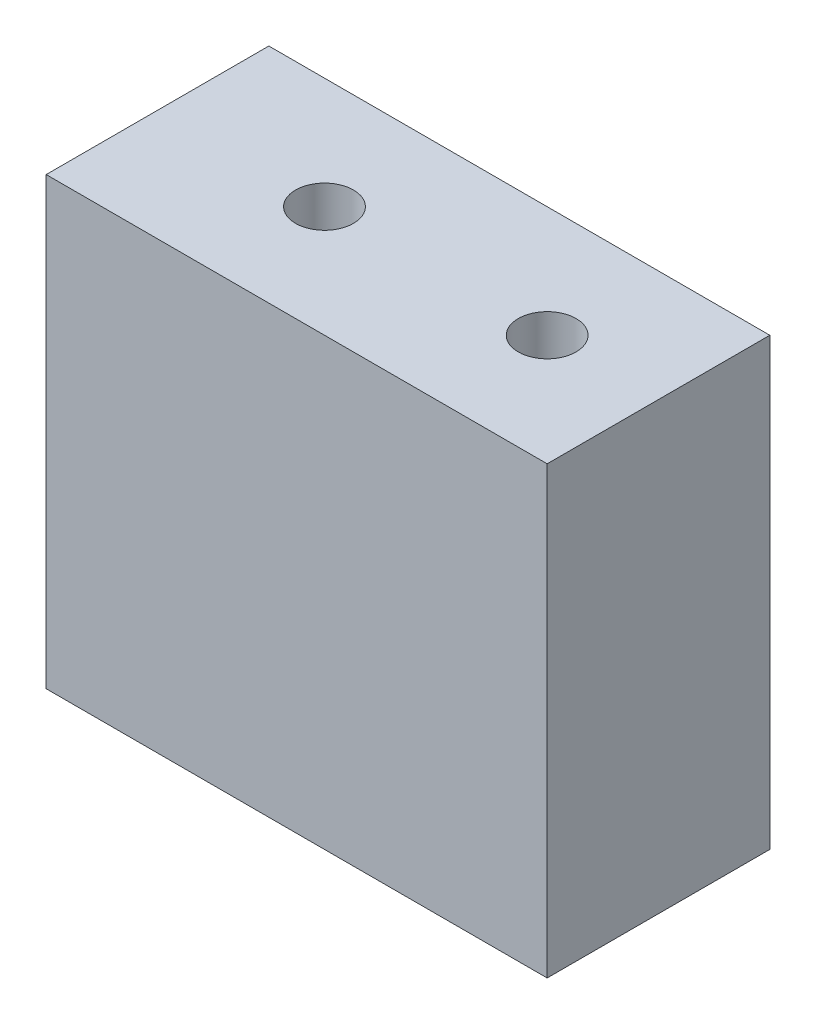
ISO-10303-21;
HEADER;
FILE_DESCRIPTION(('STEP AP214'),'2;1');
FILE_NAME('part.step','',(''),(''),'','','');
FILE_SCHEMA(('AUTOMOTIVE_DESIGN { 1 0 10303 214 1 1 1 1 }'));
ENDSEC;
DATA;
#1=APPLICATION_CONTEXT('core data for automotive mechanical design processes');
#2=APPLICATION_PROTOCOL_DEFINITION('international standard','automotive_design',2000,#1);
#3=PRODUCT_CONTEXT('',#1,'mechanical');
#4=PRODUCT('Part','Part','',(#3));
#5=PRODUCT_RELATED_PRODUCT_CATEGORY('part','',(#4));
#6=PRODUCT_DEFINITION_FORMATION('','',#4);
#7=PRODUCT_DEFINITION_CONTEXT('part definition',#1,'design');
#8=PRODUCT_DEFINITION('design','',#6,#7);
#9=PRODUCT_DEFINITION_SHAPE('','',#8);
#10=(LENGTH_UNIT() NAMED_UNIT(*) SI_UNIT(.MILLI.,.METRE.));
#11=(NAMED_UNIT(*) PLANE_ANGLE_UNIT() SI_UNIT($,.RADIAN.));
#12=(NAMED_UNIT(*) SI_UNIT($,.STERADIAN.) SOLID_ANGLE_UNIT());
#13=UNCERTAINTY_MEASURE_WITH_UNIT(LENGTH_MEASURE(1.E-05),#10,'distance_accuracy_value','');
#14=(GEOMETRIC_REPRESENTATION_CONTEXT(3) GLOBAL_UNCERTAINTY_ASSIGNED_CONTEXT((#13)) GLOBAL_UNIT_ASSIGNED_CONTEXT((#10,
#11,#12)) REPRESENTATION_CONTEXT('',''));
#15=CARTESIAN_POINT('',(0.,0.,0.));
#16=DIRECTION('',(0.,0.,1.));
#17=DIRECTION('',(1.,0.,0.));
#18=AXIS2_PLACEMENT_3D('',#15,#16,#17);
#19=CARTESIAN_POINT('',(28.575,-25.4,25.4));
#20=DIRECTION('',(-1.,0.,0.));
#21=DIRECTION('',(0.,0.,1.));
#22=AXIS2_PLACEMENT_3D('',#19,#20,#21);
#23=PLANE('',#22);
#24=DIRECTION('',(0.,1.,0.));
#25=VECTOR('',#24,1.);
#26=CARTESIAN_POINT('',(28.575,-25.4,0.));
#27=LINE('',#26,#25);
#28=CARTESIAN_POINT('',(28.575,-25.4,0.));
#29=VERTEX_POINT('',#28);
#30=CARTESIAN_POINT('',(28.575,25.4,0.));
#31=VERTEX_POINT('',#30);
#32=EDGE_CURVE('E110',#29,#31,#27,.T.);
#33=ORIENTED_EDGE('',*,*,#32,.T.);
#34=DIRECTION('',(0.,0.,-1.));
#35=VECTOR('',#34,1.);
#36=CARTESIAN_POINT('',(28.575,25.4,25.4));
#37=LINE('',#36,#35);
#38=CARTESIAN_POINT('',(28.575,25.4,25.4));
#39=VERTEX_POINT('',#38);
#40=EDGE_CURVE('E11',#39,#31,#37,.T.);
#41=ORIENTED_EDGE('',*,*,#40,.F.);
#42=DIRECTION('',(0.,1.,0.));
#43=VECTOR('',#42,1.);
#44=CARTESIAN_POINT('',(28.575,-25.4,25.4));
#45=LINE('',#44,#43);
#46=CARTESIAN_POINT('',(28.575,-25.4,25.4));
#47=VERTEX_POINT('',#46);
#48=EDGE_CURVE('E92',#47,#39,#45,.T.);
#49=ORIENTED_EDGE('',*,*,#48,.F.);
#50=DIRECTION('',(0.,0.,-1.));
#51=VECTOR('',#50,1.);
#52=CARTESIAN_POINT('',(28.575,-25.4,25.4));
#53=LINE('',#52,#51);
#54=EDGE_CURVE('E106',#47,#29,#53,.T.);
#55=ORIENTED_EDGE('',*,*,#54,.T.);
#56=EDGE_LOOP('',(#33,#41,#49,#55));
#57=FACE_BOUND('',#56,.T.);
#58=ADVANCED_FACE('F40',(#57),#23,.F.);
#59=CARTESIAN_POINT('',(-28.575,25.4,25.4));
#60=DIRECTION('',(0.,-1.,0.));
#61=DIRECTION('',(0.,0.,-1.));
#62=AXIS2_PLACEMENT_3D('',#59,#60,#61);
#63=PLANE('',#62);
#64=CARTESIAN_POINT('',(-9.525,25.4,12.7));
#65=DIRECTION('',(0.,1.,0.));
#66=DIRECTION('',(0.,0.,1.));
#67=AXIS2_PLACEMENT_3D('',#64,#65,#66);
#68=CIRCLE('',#67,3.302);
#69=CARTESIAN_POINT('',(-9.525,25.4,16.002));
#70=VERTEX_POINT('',#69);
#71=EDGE_CURVE('E137',#70,#70,#68,.T.);
#72=ORIENTED_EDGE('',*,*,#71,.F.);
#73=EDGE_LOOP('',(#72));
#74=FACE_BOUND('',#73,.T.);
#75=CARTESIAN_POINT('',(15.875,25.4,12.7));
#76=DIRECTION('',(0.,1.,0.));
#77=DIRECTION('',(0.,0.,1.));
#78=AXIS2_PLACEMENT_3D('',#75,#76,#77);
#79=CIRCLE('',#78,3.302);
#80=CARTESIAN_POINT('',(15.875,25.4,16.002));
#81=VERTEX_POINT('',#80);
#82=EDGE_CURVE('E131',#81,#81,#79,.T.);
#83=ORIENTED_EDGE('',*,*,#82,.F.);
#84=EDGE_LOOP('',(#83));
#85=FACE_BOUND('',#84,.T.);
#86=DIRECTION('',(-1.,0.,0.));
#87=VECTOR('',#86,1.);
#88=CARTESIAN_POINT('',(-28.575,25.4,0.));
#89=LINE('',#88,#87);
#90=CARTESIAN_POINT('',(-28.575,25.4,0.));
#91=VERTEX_POINT('',#90);
#92=EDGE_CURVE('E97',#31,#91,#89,.T.);
#93=ORIENTED_EDGE('',*,*,#92,.T.);
#94=DIRECTION('',(0.,0.,-1.));
#95=VECTOR('',#94,1.);
#96=CARTESIAN_POINT('',(-28.575,25.4,25.4));
#97=LINE('',#96,#95);
#98=CARTESIAN_POINT('',(-28.575,25.4,25.4));
#99=VERTEX_POINT('',#98);
#100=EDGE_CURVE('E49',#99,#91,#97,.T.);
#101=ORIENTED_EDGE('',*,*,#100,.F.);
#102=DIRECTION('',(-1.,0.,0.));
#103=VECTOR('',#102,1.);
#104=CARTESIAN_POINT('',(-28.575,25.4,25.4));
#105=LINE('',#104,#103);
#106=EDGE_CURVE('E87',#39,#99,#105,.T.);
#107=ORIENTED_EDGE('',*,*,#106,.F.);
#108=ORIENTED_EDGE('',*,*,#40,.T.);
#109=EDGE_LOOP('',(#93,#101,#107,#108));
#110=FACE_BOUND('',#109,.T.);
#111=ADVANCED_FACE('F96',(#74,#85,#110),#63,.F.);
#112=CARTESIAN_POINT('',(-28.575,-25.4,25.4));
#113=DIRECTION('',(1.,0.,0.));
#114=DIRECTION('',(0.,0.,-1.));
#115=AXIS2_PLACEMENT_3D('',#112,#113,#114);
#116=PLANE('',#115);
#117=DIRECTION('',(0.,-1.,0.));
#118=VECTOR('',#117,1.);
#119=CARTESIAN_POINT('',(-28.575,-25.4,0.));
#120=LINE('',#119,#118);
#121=CARTESIAN_POINT('',(-28.575,-25.4,0.));
#122=VERTEX_POINT('',#121);
#123=EDGE_CURVE('E74',#91,#122,#120,.T.);
#124=ORIENTED_EDGE('',*,*,#123,.T.);
#125=DIRECTION('',(0.,0.,-1.));
#126=VECTOR('',#125,1.);
#127=CARTESIAN_POINT('',(-28.575,-25.4,25.4));
#128=LINE('',#127,#126);
#129=CARTESIAN_POINT('',(-28.575,-25.4,25.4));
#130=VERTEX_POINT('',#129);
#131=EDGE_CURVE('E99',#130,#122,#128,.T.);
#132=ORIENTED_EDGE('',*,*,#131,.F.);
#133=DIRECTION('',(0.,-1.,0.));
#134=VECTOR('',#133,1.);
#135=CARTESIAN_POINT('',(-28.575,-25.4,25.4));
#136=LINE('',#135,#134);
#137=EDGE_CURVE('E90',#99,#130,#136,.T.);
#138=ORIENTED_EDGE('',*,*,#137,.F.);
#139=ORIENTED_EDGE('',*,*,#100,.T.);
#140=EDGE_LOOP('',(#124,#132,#138,#139));
#141=FACE_BOUND('',#140,.T.);
#142=ADVANCED_FACE('F100',(#141),#116,.F.);
#143=CARTESIAN_POINT('',(-28.575,-25.4,25.4));
#144=DIRECTION('',(0.,1.,0.));
#145=DIRECTION('',(0.,0.,1.));
#146=AXIS2_PLACEMENT_3D('',#143,#144,#145);
#147=PLANE('',#146);
#148=CARTESIAN_POINT('',(-9.525,-25.4,12.7));
#149=DIRECTION('',(0.,1.,0.));
#150=DIRECTION('',(0.,0.,1.));
#151=AXIS2_PLACEMENT_3D('',#148,#149,#150);
#152=CIRCLE('',#151,3.302);
#153=CARTESIAN_POINT('',(-9.525,-25.4,16.002));
#154=VERTEX_POINT('',#153);
#155=EDGE_CURVE('E114',#154,#154,#152,.T.);
#156=ORIENTED_EDGE('',*,*,#155,.T.);
#157=EDGE_LOOP('',(#156));
#158=FACE_BOUND('',#157,.T.);
#159=CARTESIAN_POINT('',(15.875,-25.4,12.7));
#160=DIRECTION('',(0.,1.,0.));
#161=DIRECTION('',(0.,0.,1.));
#162=AXIS2_PLACEMENT_3D('',#159,#160,#161);
#163=CIRCLE('',#162,3.302);
#164=CARTESIAN_POINT('',(15.875,-25.4,16.002));
#165=VERTEX_POINT('',#164);
#166=EDGE_CURVE('E134',#165,#165,#163,.T.);
#167=ORIENTED_EDGE('',*,*,#166,.T.);
#168=EDGE_LOOP('',(#167));
#169=FACE_BOUND('',#168,.T.);
#170=DIRECTION('',(1.,0.,0.));
#171=VECTOR('',#170,1.);
#172=CARTESIAN_POINT('',(-28.575,-25.4,0.));
#173=LINE('',#172,#171);
#174=EDGE_CURVE('E80',#122,#29,#173,.T.);
#175=ORIENTED_EDGE('',*,*,#174,.T.);
#176=ORIENTED_EDGE('',*,*,#54,.F.);
#177=DIRECTION('',(1.,0.,0.));
#178=VECTOR('',#177,1.);
#179=CARTESIAN_POINT('',(-28.575,-25.4,25.4));
#180=LINE('',#179,#178);
#181=EDGE_CURVE('E57',#130,#47,#180,.T.);
#182=ORIENTED_EDGE('',*,*,#181,.F.);
#183=ORIENTED_EDGE('',*,*,#131,.T.);
#184=EDGE_LOOP('',(#175,#176,#182,#183));
#185=FACE_BOUND('',#184,.T.);
#186=ADVANCED_FACE('F124',(#158,#169,#185),#147,.F.);
#187=CARTESIAN_POINT('',(0.,0.,25.4));
#188=DIRECTION('',(0.,0.,-1.));
#189=DIRECTION('',(-1.,0.,0.));
#190=AXIS2_PLACEMENT_3D('',#187,#188,#189);
#191=PLANE('',#190);
#192=ORIENTED_EDGE('',*,*,#48,.T.);
#193=ORIENTED_EDGE('',*,*,#106,.T.);
#194=ORIENTED_EDGE('',*,*,#137,.T.);
#195=ORIENTED_EDGE('',*,*,#181,.T.);
#196=EDGE_LOOP('',(#192,#193,#194,#195));
#197=FACE_BOUND('',#196,.T.);
#198=ADVANCED_FACE('F88',(#197),#191,.F.);
#199=CARTESIAN_POINT('',(0.,0.,0.));
#200=DIRECTION('',(0.,0.,-1.));
#201=DIRECTION('',(-1.,0.,0.));
#202=AXIS2_PLACEMENT_3D('',#199,#200,#201);
#203=PLANE('',#202);
#204=ORIENTED_EDGE('',*,*,#32,.F.);
#205=ORIENTED_EDGE('',*,*,#174,.F.);
#206=ORIENTED_EDGE('',*,*,#123,.F.);
#207=ORIENTED_EDGE('',*,*,#92,.F.);
#208=EDGE_LOOP('',(#204,#205,#206,#207));
#209=FACE_BOUND('',#208,.T.);
#210=ADVANCED_FACE('F127',(#209),#203,.T.);
#211=CARTESIAN_POINT('',(15.875,-25.4,12.7));
#212=DIRECTION('',(0.,1.,0.));
#213=DIRECTION('',(0.,0.,1.));
#214=AXIS2_PLACEMENT_3D('',#211,#212,#213);
#215=CYLINDRICAL_SURFACE('',#214,3.302);
#216=ORIENTED_EDGE('',*,*,#166,.F.);
#217=EDGE_LOOP('',(#216));
#218=FACE_BOUND('',#217,.T.);
#219=ORIENTED_EDGE('',*,*,#82,.T.);
#220=EDGE_LOOP('',(#219));
#221=FACE_BOUND('',#220,.T.);
#222=ADVANCED_FACE('F150',(#218,#221),#215,.F.);
#223=CARTESIAN_POINT('',(-9.525,-25.4,12.7));
#224=DIRECTION('',(0.,1.,0.));
#225=DIRECTION('',(0.,0.,1.));
#226=AXIS2_PLACEMENT_3D('',#223,#224,#225);
#227=CYLINDRICAL_SURFACE('',#226,3.302);
#228=ORIENTED_EDGE('',*,*,#155,.F.);
#229=EDGE_LOOP('',(#228));
#230=FACE_BOUND('',#229,.T.);
#231=ORIENTED_EDGE('',*,*,#71,.T.);
#232=EDGE_LOOP('',(#231));
#233=FACE_BOUND('',#232,.T.);
#234=ADVANCED_FACE('F147',(#230,#233),#227,.F.);
#235=CLOSED_SHELL('',(#58,#111,#142,#186,#198,#210,#222,#234));
#236=MANIFOLD_SOLID_BREP('B2',#235);
#237=ADVANCED_BREP_SHAPE_REPRESENTATION('',(#18,#236),#14);
#238=SHAPE_DEFINITION_REPRESENTATION(#9,#237);
ENDSEC;
END-ISO-10303-21;
